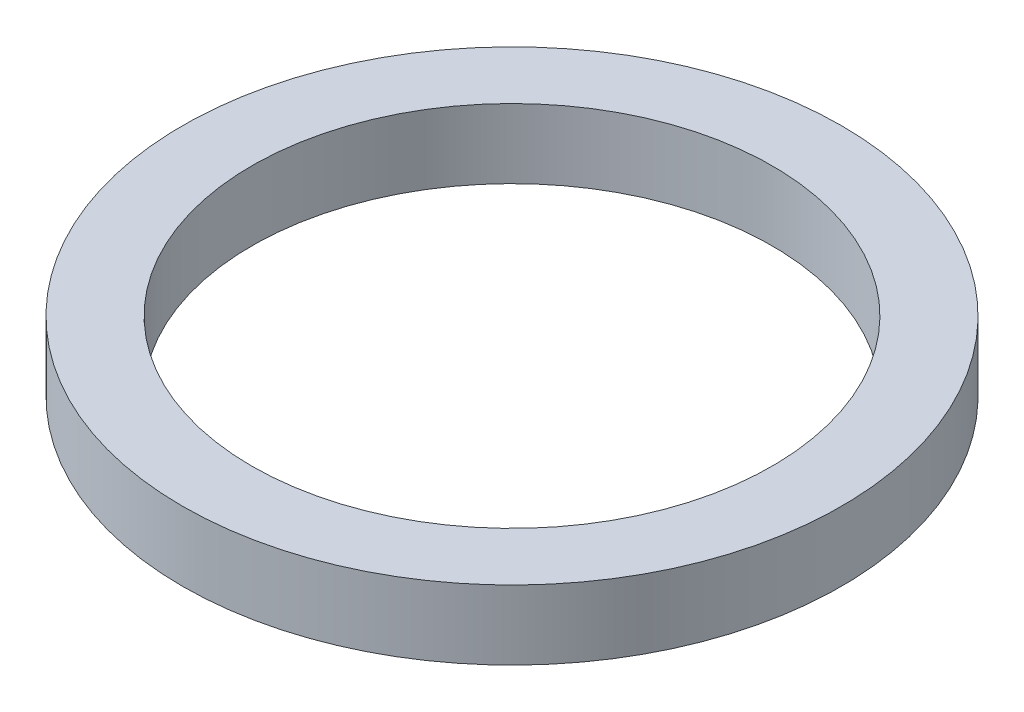
ISO-10303-21;
HEADER;
FILE_DESCRIPTION(('STEP AP214'),'2;1');
FILE_NAME('part.step','',(''),(''),'','','');
FILE_SCHEMA(('AUTOMOTIVE_DESIGN { 1 0 10303 214 1 1 1 1 }'));
ENDSEC;
DATA;
#1=APPLICATION_CONTEXT('core data for automotive mechanical design processes');
#2=APPLICATION_PROTOCOL_DEFINITION('international standard','automotive_design',2000,#1);
#3=PRODUCT_CONTEXT('',#1,'mechanical');
#4=PRODUCT('Part','Part','',(#3));
#5=PRODUCT_RELATED_PRODUCT_CATEGORY('part','',(#4));
#6=PRODUCT_DEFINITION_FORMATION('','',#4);
#7=PRODUCT_DEFINITION_CONTEXT('part definition',#1,'design');
#8=PRODUCT_DEFINITION('design','',#6,#7);
#9=PRODUCT_DEFINITION_SHAPE('','',#8);
#10=(LENGTH_UNIT() NAMED_UNIT(*) SI_UNIT(.MILLI.,.METRE.));
#11=(NAMED_UNIT(*) PLANE_ANGLE_UNIT() SI_UNIT($,.RADIAN.));
#12=(NAMED_UNIT(*) SI_UNIT($,.STERADIAN.) SOLID_ANGLE_UNIT());
#13=UNCERTAINTY_MEASURE_WITH_UNIT(LENGTH_MEASURE(1.E-05),#10,'distance_accuracy_value','');
#14=(GEOMETRIC_REPRESENTATION_CONTEXT(3) GLOBAL_UNCERTAINTY_ASSIGNED_CONTEXT((#13)) GLOBAL_UNIT_ASSIGNED_CONTEXT((#10,
#11,#12)) REPRESENTATION_CONTEXT('',''));
#15=CARTESIAN_POINT('',(0.,0.,0.));
#16=DIRECTION('',(0.,0.,1.));
#17=DIRECTION('',(1.,0.,0.));
#18=AXIS2_PLACEMENT_3D('',#15,#16,#17);
#19=CARTESIAN_POINT('',(0.,10.,0.));
#20=DIRECTION('',(0.,1.,0.));
#21=DIRECTION('',(0.,0.,1.));
#22=AXIS2_PLACEMENT_3D('',#19,#20,#21);
#23=PLANE('',#22);
#24=CARTESIAN_POINT('',(0.,10.,0.));
#25=DIRECTION('',(0.,1.,0.));
#26=DIRECTION('',(0.,0.,1.));
#27=AXIS2_PLACEMENT_3D('',#24,#25,#26);
#28=CIRCLE('',#27,47.5);
#29=CARTESIAN_POINT('',(0.,10.,47.5));
#30=VERTEX_POINT('',#29);
#31=EDGE_CURVE('E10',#30,#30,#28,.T.);
#32=ORIENTED_EDGE('',*,*,#31,.T.);
#33=EDGE_LOOP('',(#32));
#34=FACE_BOUND('',#33,.T.);
#35=CARTESIAN_POINT('',(0.,10.,0.));
#36=DIRECTION('',(0.,1.,0.));
#37=DIRECTION('',(0.,0.,1.));
#38=AXIS2_PLACEMENT_3D('',#35,#36,#37);
#39=CIRCLE('',#38,37.5);
#40=CARTESIAN_POINT('',(0.,10.,37.5));
#41=VERTEX_POINT('',#40);
#42=EDGE_CURVE('E54',#41,#41,#39,.T.);
#43=ORIENTED_EDGE('',*,*,#42,.F.);
#44=EDGE_LOOP('',(#43));
#45=FACE_BOUND('',#44,.T.);
#46=ADVANCED_FACE('F41',(#34,#45),#23,.T.);
#47=CARTESIAN_POINT('',(0.,0.,0.));
#48=DIRECTION('',(0.,1.,0.));
#49=DIRECTION('',(0.,0.,1.));
#50=AXIS2_PLACEMENT_3D('',#47,#48,#49);
#51=PLANE('',#50);
#52=CARTESIAN_POINT('',(0.,0.,0.));
#53=DIRECTION('',(0.,1.,0.));
#54=DIRECTION('',(0.,0.,1.));
#55=AXIS2_PLACEMENT_3D('',#52,#53,#54);
#56=CIRCLE('',#55,47.5);
#57=CARTESIAN_POINT('',(0.,0.,47.5));
#58=VERTEX_POINT('',#57);
#59=EDGE_CURVE('E45',#58,#58,#56,.T.);
#60=ORIENTED_EDGE('',*,*,#59,.F.);
#61=EDGE_LOOP('',(#60));
#62=FACE_BOUND('',#61,.T.);
#63=CARTESIAN_POINT('',(0.,0.,0.));
#64=DIRECTION('',(0.,1.,0.));
#65=DIRECTION('',(0.,0.,1.));
#66=AXIS2_PLACEMENT_3D('',#63,#64,#65);
#67=CIRCLE('',#66,37.5);
#68=CARTESIAN_POINT('',(0.,0.,37.5));
#69=VERTEX_POINT('',#68);
#70=EDGE_CURVE('E56',#69,#69,#67,.T.);
#71=ORIENTED_EDGE('',*,*,#70,.T.);
#72=EDGE_LOOP('',(#71));
#73=FACE_BOUND('',#72,.T.);
#74=ADVANCED_FACE('F68',(#62,#73),#51,.F.);
#75=CARTESIAN_POINT('',(0.,10.,0.));
#76=DIRECTION('',(0.,-1.,0.));
#77=DIRECTION('',(0.,0.,-1.));
#78=AXIS2_PLACEMENT_3D('',#75,#76,#77);
#79=CYLINDRICAL_SURFACE('',#78,47.5);
#80=ORIENTED_EDGE('',*,*,#31,.F.);
#81=EDGE_LOOP('',(#80));
#82=FACE_BOUND('',#81,.T.);
#83=ORIENTED_EDGE('',*,*,#59,.T.);
#84=EDGE_LOOP('',(#83));
#85=FACE_BOUND('',#84,.T.);
#86=ADVANCED_FACE('F43',(#82,#85),#79,.T.);
#87=CARTESIAN_POINT('',(0.,10.,0.));
#88=DIRECTION('',(0.,-1.,0.));
#89=DIRECTION('',(0.,0.,-1.));
#90=AXIS2_PLACEMENT_3D('',#87,#88,#89);
#91=CYLINDRICAL_SURFACE('',#90,37.5);
#92=ORIENTED_EDGE('',*,*,#42,.T.);
#93=EDGE_LOOP('',(#92));
#94=FACE_BOUND('',#93,.T.);
#95=ORIENTED_EDGE('',*,*,#70,.F.);
#96=EDGE_LOOP('',(#95));
#97=FACE_BOUND('',#96,.T.);
#98=ADVANCED_FACE('F64',(#94,#97),#91,.F.);
#99=CLOSED_SHELL('',(#46,#74,#86,#98));
#100=MANIFOLD_SOLID_BREP('B2',#99);
#101=ADVANCED_BREP_SHAPE_REPRESENTATION('',(#18,#100),#14);
#102=SHAPE_DEFINITION_REPRESENTATION(#9,#101);
ENDSEC;
END-ISO-10303-21;
